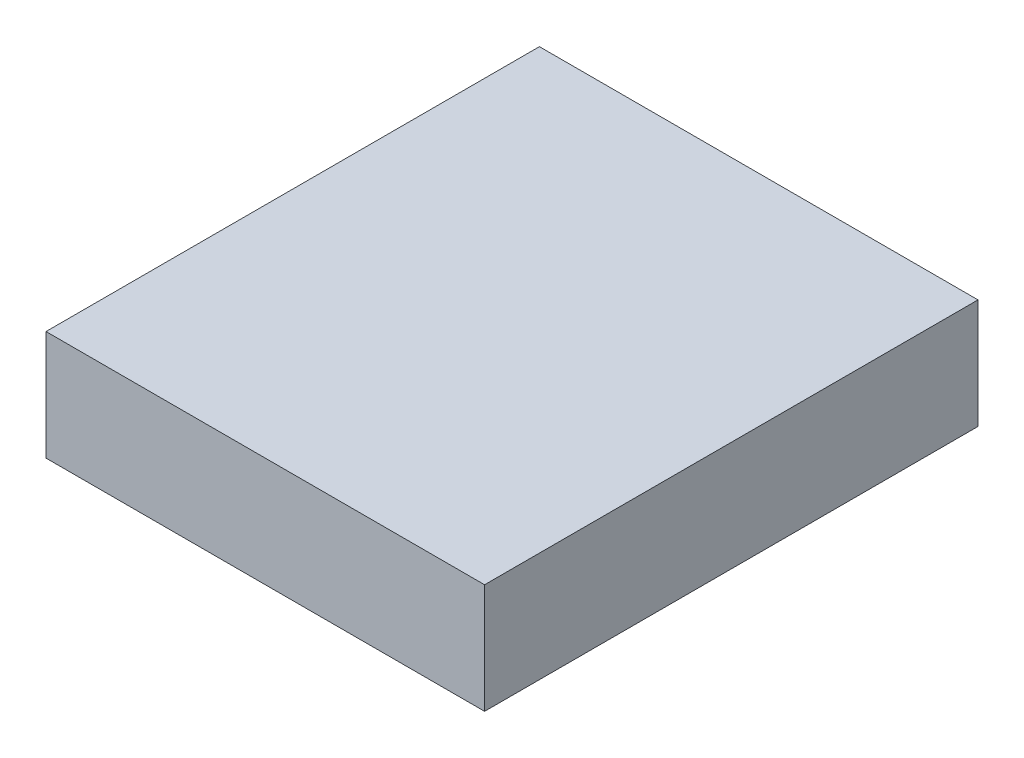
ISO-10303-21;
HEADER;
FILE_DESCRIPTION(('STEP AP214'),'2;1');
FILE_NAME('part.step','',(''),(''),'','','');
FILE_SCHEMA(('AUTOMOTIVE_DESIGN { 1 0 10303 214 1 1 1 1 }'));
ENDSEC;
DATA;
#1=APPLICATION_CONTEXT('core data for automotive mechanical design processes');
#2=APPLICATION_PROTOCOL_DEFINITION('international standard','automotive_design',2000,#1);
#3=PRODUCT_CONTEXT('',#1,'mechanical');
#4=PRODUCT('Part','Part','',(#3));
#5=PRODUCT_RELATED_PRODUCT_CATEGORY('part','',(#4));
#6=PRODUCT_DEFINITION_FORMATION('','',#4);
#7=PRODUCT_DEFINITION_CONTEXT('part definition',#1,'design');
#8=PRODUCT_DEFINITION('design','',#6,#7);
#9=PRODUCT_DEFINITION_SHAPE('','',#8);
#10=(LENGTH_UNIT() NAMED_UNIT(*) SI_UNIT(.MILLI.,.METRE.));
#11=(NAMED_UNIT(*) PLANE_ANGLE_UNIT() SI_UNIT($,.RADIAN.));
#12=(NAMED_UNIT(*) SI_UNIT($,.STERADIAN.) SOLID_ANGLE_UNIT());
#13=UNCERTAINTY_MEASURE_WITH_UNIT(LENGTH_MEASURE(1.E-05),#10,'distance_accuracy_value','');
#14=(GEOMETRIC_REPRESENTATION_CONTEXT(3) GLOBAL_UNCERTAINTY_ASSIGNED_CONTEXT((#13)) GLOBAL_UNIT_ASSIGNED_CONTEXT((#10,
#11,#12)) REPRESENTATION_CONTEXT('',''));
#15=CARTESIAN_POINT('',(0.,0.,0.));
#16=DIRECTION('',(0.,0.,1.));
#17=DIRECTION('',(1.,0.,0.));
#18=AXIS2_PLACEMENT_3D('',#15,#16,#17);
#19=CARTESIAN_POINT('',(1.,0.5,1.125));
#20=DIRECTION('',(-1.,0.,0.));
#21=DIRECTION('',(0.,0.,1.));
#22=AXIS2_PLACEMENT_3D('',#19,#20,#21);
#23=PLANE('',#22);
#24=DIRECTION('',(0.,0.,-1.));
#25=VECTOR('',#24,1.);
#26=CARTESIAN_POINT('',(1.,0.,1.125));
#27=LINE('',#26,#25);
#28=CARTESIAN_POINT('',(1.,0.,1.125));
#29=VERTEX_POINT('',#28);
#30=CARTESIAN_POINT('',(1.,0.,-1.125));
#31=VERTEX_POINT('',#30);
#32=EDGE_CURVE('E107',#29,#31,#27,.T.);
#33=ORIENTED_EDGE('',*,*,#32,.T.);
#34=DIRECTION('',(0.,-1.,0.));
#35=VECTOR('',#34,1.);
#36=CARTESIAN_POINT('',(1.,0.5,-1.125));
#37=LINE('',#36,#35);
#38=CARTESIAN_POINT('',(1.,0.5,-1.125));
#39=VERTEX_POINT('',#38);
#40=EDGE_CURVE('E11',#39,#31,#37,.T.);
#41=ORIENTED_EDGE('',*,*,#40,.F.);
#42=DIRECTION('',(0.,0.,-1.));
#43=VECTOR('',#42,1.);
#44=CARTESIAN_POINT('',(1.,0.5,1.125));
#45=LINE('',#44,#43);
#46=CARTESIAN_POINT('',(1.,0.5,1.125));
#47=VERTEX_POINT('',#46);
#48=EDGE_CURVE('E91',#47,#39,#45,.T.);
#49=ORIENTED_EDGE('',*,*,#48,.F.);
#50=DIRECTION('',(0.,-1.,0.));
#51=VECTOR('',#50,1.);
#52=CARTESIAN_POINT('',(1.,0.5,1.125));
#53=LINE('',#52,#51);
#54=EDGE_CURVE('E103',#47,#29,#53,.T.);
#55=ORIENTED_EDGE('',*,*,#54,.T.);
#56=EDGE_LOOP('',(#33,#41,#49,#55));
#57=FACE_BOUND('',#56,.T.);
#58=ADVANCED_FACE('F39',(#57),#23,.F.);
#59=CARTESIAN_POINT('',(-1.,0.5,-1.125));
#60=DIRECTION('',(0.,0.,1.));
#61=DIRECTION('',(1.,0.,0.));
#62=AXIS2_PLACEMENT_3D('',#59,#60,#61);
#63=PLANE('',#62);
#64=DIRECTION('',(-1.,0.,0.));
#65=VECTOR('',#64,1.);
#66=CARTESIAN_POINT('',(-1.,0.,-1.125));
#67=LINE('',#66,#65);
#68=CARTESIAN_POINT('',(-1.,0.,-1.125));
#69=VERTEX_POINT('',#68);
#70=EDGE_CURVE('E96',#31,#69,#67,.T.);
#71=ORIENTED_EDGE('',*,*,#70,.T.);
#72=DIRECTION('',(0.,-1.,0.));
#73=VECTOR('',#72,1.);
#74=CARTESIAN_POINT('',(-1.,0.5,-1.125));
#75=LINE('',#74,#73);
#76=CARTESIAN_POINT('',(-1.,0.5,-1.125));
#77=VERTEX_POINT('',#76);
#78=EDGE_CURVE('E48',#77,#69,#75,.T.);
#79=ORIENTED_EDGE('',*,*,#78,.F.);
#80=DIRECTION('',(-1.,0.,0.));
#81=VECTOR('',#80,1.);
#82=CARTESIAN_POINT('',(-1.,0.5,-1.125));
#83=LINE('',#82,#81);
#84=EDGE_CURVE('E86',#39,#77,#83,.T.);
#85=ORIENTED_EDGE('',*,*,#84,.F.);
#86=ORIENTED_EDGE('',*,*,#40,.T.);
#87=EDGE_LOOP('',(#71,#79,#85,#86));
#88=FACE_BOUND('',#87,.T.);
#89=ADVANCED_FACE('F95',(#88),#63,.F.);
#90=CARTESIAN_POINT('',(-1.,0.5,1.125));
#91=DIRECTION('',(1.,0.,0.));
#92=DIRECTION('',(0.,0.,-1.));
#93=AXIS2_PLACEMENT_3D('',#90,#91,#92);
#94=PLANE('',#93);
#95=DIRECTION('',(0.,0.,1.));
#96=VECTOR('',#95,1.);
#97=CARTESIAN_POINT('',(-1.,0.,1.125));
#98=LINE('',#97,#96);
#99=CARTESIAN_POINT('',(-1.,0.,1.125));
#100=VERTEX_POINT('',#99);
#101=EDGE_CURVE('E73',#69,#100,#98,.T.);
#102=ORIENTED_EDGE('',*,*,#101,.T.);
#103=DIRECTION('',(0.,-1.,0.));
#104=VECTOR('',#103,1.);
#105=CARTESIAN_POINT('',(-1.,0.5,1.125));
#106=LINE('',#105,#104);
#107=CARTESIAN_POINT('',(-1.,0.5,1.125));
#108=VERTEX_POINT('',#107);
#109=EDGE_CURVE('E98',#108,#100,#106,.T.);
#110=ORIENTED_EDGE('',*,*,#109,.F.);
#111=DIRECTION('',(0.,0.,1.));
#112=VECTOR('',#111,1.);
#113=CARTESIAN_POINT('',(-1.,0.5,1.125));
#114=LINE('',#113,#112);
#115=EDGE_CURVE('E89',#77,#108,#114,.T.);
#116=ORIENTED_EDGE('',*,*,#115,.F.);
#117=ORIENTED_EDGE('',*,*,#78,.T.);
#118=EDGE_LOOP('',(#102,#110,#116,#117));
#119=FACE_BOUND('',#118,.T.);
#120=ADVANCED_FACE('F99',(#119),#94,.F.);
#121=CARTESIAN_POINT('',(-1.,0.5,1.125));
#122=DIRECTION('',(0.,0.,-1.));
#123=DIRECTION('',(-1.,0.,0.));
#124=AXIS2_PLACEMENT_3D('',#121,#122,#123);
#125=PLANE('',#124);
#126=DIRECTION('',(1.,0.,0.));
#127=VECTOR('',#126,1.);
#128=CARTESIAN_POINT('',(-1.,0.,1.125));
#129=LINE('',#128,#127);
#130=EDGE_CURVE('E79',#100,#29,#129,.T.);
#131=ORIENTED_EDGE('',*,*,#130,.T.);
#132=ORIENTED_EDGE('',*,*,#54,.F.);
#133=DIRECTION('',(1.,0.,0.));
#134=VECTOR('',#133,1.);
#135=CARTESIAN_POINT('',(-1.,0.5,1.125));
#136=LINE('',#135,#134);
#137=EDGE_CURVE('E56',#108,#47,#136,.T.);
#138=ORIENTED_EDGE('',*,*,#137,.F.);
#139=ORIENTED_EDGE('',*,*,#109,.T.);
#140=EDGE_LOOP('',(#131,#132,#138,#139));
#141=FACE_BOUND('',#140,.T.);
#142=ADVANCED_FACE('F120',(#141),#125,.F.);
#143=CARTESIAN_POINT('',(0.,0.5,0.));
#144=DIRECTION('',(0.,-1.,0.));
#145=DIRECTION('',(0.,0.,-1.));
#146=AXIS2_PLACEMENT_3D('',#143,#144,#145);
#147=PLANE('',#146);
#148=ORIENTED_EDGE('',*,*,#48,.T.);
#149=ORIENTED_EDGE('',*,*,#84,.T.);
#150=ORIENTED_EDGE('',*,*,#115,.T.);
#151=ORIENTED_EDGE('',*,*,#137,.T.);
#152=EDGE_LOOP('',(#148,#149,#150,#151));
#153=FACE_BOUND('',#152,.T.);
#154=ADVANCED_FACE('F87',(#153),#147,.F.);
#155=CARTESIAN_POINT('',(0.,0.,0.));
#156=DIRECTION('',(0.,-1.,0.));
#157=DIRECTION('',(0.,0.,-1.));
#158=AXIS2_PLACEMENT_3D('',#155,#156,#157);
#159=PLANE('',#158);
#160=ORIENTED_EDGE('',*,*,#32,.F.);
#161=ORIENTED_EDGE('',*,*,#130,.F.);
#162=ORIENTED_EDGE('',*,*,#101,.F.);
#163=ORIENTED_EDGE('',*,*,#70,.F.);
#164=EDGE_LOOP('',(#160,#161,#162,#163));
#165=FACE_BOUND('',#164,.T.);
#166=ADVANCED_FACE('F123',(#165),#159,.T.);
#167=CLOSED_SHELL('',(#58,#89,#120,#142,#154,#166));
#168=MANIFOLD_SOLID_BREP('B2',#167);
#169=ADVANCED_BREP_SHAPE_REPRESENTATION('',(#18,#168),#14);
#170=SHAPE_DEFINITION_REPRESENTATION(#9,#169);
ENDSEC;
END-ISO-10303-21;
